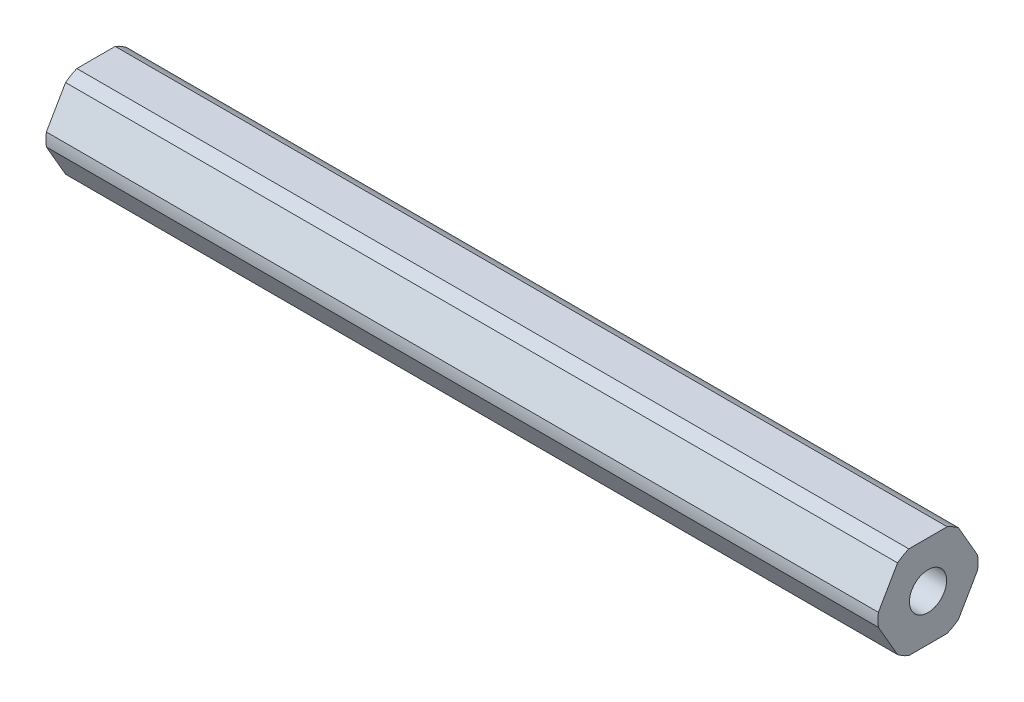
ISO-10303-21;
HEADER;
FILE_DESCRIPTION(('STEP AP214'),'2;1');
FILE_NAME('part.step','',(''),(''),'','','');
FILE_SCHEMA(('AUTOMOTIVE_DESIGN { 1 0 10303 214 1 1 1 1 }'));
ENDSEC;
DATA;
#1=APPLICATION_CONTEXT('core data for automotive mechanical design processes');
#2=APPLICATION_PROTOCOL_DEFINITION('international standard','automotive_design',2000,#1);
#3=PRODUCT_CONTEXT('',#1,'mechanical');
#4=PRODUCT('Part','Part','',(#3));
#5=PRODUCT_RELATED_PRODUCT_CATEGORY('part','',(#4));
#6=PRODUCT_DEFINITION_FORMATION('','',#4);
#7=PRODUCT_DEFINITION_CONTEXT('part definition',#1,'design');
#8=PRODUCT_DEFINITION('design','',#6,#7);
#9=PRODUCT_DEFINITION_SHAPE('','',#8);
#10=(LENGTH_UNIT() NAMED_UNIT(*) SI_UNIT(.MILLI.,.METRE.));
#11=(NAMED_UNIT(*) PLANE_ANGLE_UNIT() SI_UNIT($,.RADIAN.));
#12=(NAMED_UNIT(*) SI_UNIT($,.STERADIAN.) SOLID_ANGLE_UNIT());
#13=UNCERTAINTY_MEASURE_WITH_UNIT(LENGTH_MEASURE(1.E-05),#10,'distance_accuracy_value','');
#14=(GEOMETRIC_REPRESENTATION_CONTEXT(3) GLOBAL_UNCERTAINTY_ASSIGNED_CONTEXT((#13)) GLOBAL_UNIT_ASSIGNED_CONTEXT((#10,
#11,#12)) REPRESENTATION_CONTEXT('',''));
#15=CARTESIAN_POINT('',(0.,0.,0.));
#16=DIRECTION('',(0.,0.,1.));
#17=DIRECTION('',(1.,0.,0.));
#18=AXIS2_PLACEMENT_3D('',#15,#16,#17);
#19=CARTESIAN_POINT('',(57.15,0.,0.));
#20=DIRECTION('',(-1.,0.,0.));
#21=DIRECTION('',(0.,0.,1.));
#22=AXIS2_PLACEMENT_3D('',#19,#20,#21);
#23=CYLINDRICAL_SURFACE('',#22,6.875);
#24=CARTESIAN_POINT('',(-57.15,0.,0.));
#25=DIRECTION('',(-1.,0.,0.));
#26=DIRECTION('',(0.,0.,1.));
#27=AXIS2_PLACEMENT_3D('',#24,#25,#26);
#28=CIRCLE('',#27,6.875);
#29=CARTESIAN_POINT('',(-57.15,0.893039494206683,6.816751826331));
#30=VERTEX_POINT('',#29);
#31=CARTESIAN_POINT('',(-57.15,-0.893039494206785,6.81675182633099));
#32=VERTEX_POINT('',#31);
#33=EDGE_CURVE('E103',#30,#32,#28,.F.);
#34=ORIENTED_EDGE('',*,*,#33,.T.);
#35=DIRECTION('',(1.,0.,0.));
#36=VECTOR('',#35,1.);
#37=CARTESIAN_POINT('',(57.15,-0.893039494206782,6.81675182633099));
#38=LINE('',#37,#36);
#39=CARTESIAN_POINT('',(57.15,-0.893039494206785,6.81675182633099));
#40=VERTEX_POINT('',#39);
#41=EDGE_CURVE('E125',#32,#40,#38,.T.);
#42=ORIENTED_EDGE('',*,*,#41,.T.);
#43=CARTESIAN_POINT('',(57.15,0.,0.));
#44=DIRECTION('',(-1.,0.,0.));
#45=DIRECTION('',(0.,0.,1.));
#46=AXIS2_PLACEMENT_3D('',#43,#44,#45);
#47=CIRCLE('',#46,6.875);
#48=CARTESIAN_POINT('',(57.15,0.893039494206684,6.816751826331));
#49=VERTEX_POINT('',#48);
#50=EDGE_CURVE('E20',#40,#49,#47,.T.);
#51=ORIENTED_EDGE('',*,*,#50,.T.);
#52=DIRECTION('',(1.,0.,0.));
#53=VECTOR('',#52,1.);
#54=CARTESIAN_POINT('',(57.15,0.893039494206683,6.816751826331));
#55=LINE('',#54,#53);
#56=EDGE_CURVE('E121',#49,#30,#55,.F.);
#57=ORIENTED_EDGE('',*,*,#56,.T.);
#58=EDGE_LOOP('',(#34,#42,#51,#57));
#59=FACE_BOUND('',#58,.T.);
#60=ADVANCED_FACE('F17',(#59),#23,.T.);
#61=CARTESIAN_POINT('',(57.15,3.17499999999999,-5.49926131403116));
#62=DIRECTION('',(0.,-0.500000000000001,0.866025403784438));
#63=DIRECTION('',(0.,-0.866025403784438,-0.500000000000001));
#64=AXIS2_PLACEMENT_3D('',#61,#62,#63);
#65=PLANE('',#64);
#66=DIRECTION('',(-1.,0.,0.));
#67=VECTOR('',#66,1.);
#68=CARTESIAN_POINT('',(57.15,5.45696050579326,-4.18177080173132));
#69=LINE('',#68,#67);
#70=CARTESIAN_POINT('',(57.15,5.45696050579326,-4.18177080173132));
#71=VERTEX_POINT('',#70);
#72=CARTESIAN_POINT('',(-57.15,5.45696050579326,-4.18177080173132));
#73=VERTEX_POINT('',#72);
#74=EDGE_CURVE('E118',#71,#73,#69,.T.);
#75=ORIENTED_EDGE('',*,*,#74,.F.);
#76=DIRECTION('',(0.,0.866025403784438,0.500000000000001));
#77=VECTOR('',#76,1.);
#78=CARTESIAN_POINT('',(57.15,0.893039494206731,-6.816751826331));
#79=LINE('',#78,#77);
#80=CARTESIAN_POINT('',(57.15,0.893039494206733,-6.816751826331));
#81=VERTEX_POINT('',#80);
#82=EDGE_CURVE('E179',#81,#71,#79,.T.);
#83=ORIENTED_EDGE('',*,*,#82,.F.);
#84=DIRECTION('',(-1.,0.,0.));
#85=VECTOR('',#84,1.);
#86=CARTESIAN_POINT('',(57.15,0.893039494206732,-6.816751826331));
#87=LINE('',#86,#85);
#88=CARTESIAN_POINT('',(-57.15,0.893039494206733,-6.816751826331));
#89=VERTEX_POINT('',#88);
#90=EDGE_CURVE('E141',#89,#81,#87,.F.);
#91=ORIENTED_EDGE('',*,*,#90,.F.);
#92=DIRECTION('',(0.,0.866025403784438,0.500000000000001));
#93=VECTOR('',#92,1.);
#94=CARTESIAN_POINT('',(-57.15,0.893039494206731,-6.816751826331));
#95=LINE('',#94,#93);
#96=EDGE_CURVE('E183',#89,#73,#95,.T.);
#97=ORIENTED_EDGE('',*,*,#96,.T.);
#98=EDGE_LOOP('',(#75,#83,#91,#97));
#99=FACE_BOUND('',#98,.T.);
#100=ADVANCED_FACE('F202',(#99),#65,.F.);
#101=CARTESIAN_POINT('',(57.15,0.,0.));
#102=DIRECTION('',(-1.,0.,0.));
#103=DIRECTION('',(0.,0.,1.));
#104=AXIS2_PLACEMENT_3D('',#101,#102,#103);
#105=CYLINDRICAL_SURFACE('',#104,6.875);
#106=CARTESIAN_POINT('',(57.15,0.,0.));
#107=DIRECTION('',(-1.,0.,0.));
#108=DIRECTION('',(0.,0.,1.));
#109=AXIS2_PLACEMENT_3D('',#106,#107,#108);
#110=CIRCLE('',#109,6.875);
#111=CARTESIAN_POINT('',(57.15,6.34999999999998,-2.63498102459965));
#112=VERTEX_POINT('',#111);
#113=EDGE_CURVE('E177',#71,#112,#110,.F.);
#114=ORIENTED_EDGE('',*,*,#113,.F.);
#115=ORIENTED_EDGE('',*,*,#74,.T.);
#116=CARTESIAN_POINT('',(-57.15,0.,0.));
#117=DIRECTION('',(-1.,0.,0.));
#118=DIRECTION('',(0.,0.,1.));
#119=AXIS2_PLACEMENT_3D('',#116,#117,#118);
#120=CIRCLE('',#119,6.875);
#121=CARTESIAN_POINT('',(-57.15,6.34999999999998,-2.63498102459965));
#122=VERTEX_POINT('',#121);
#123=EDGE_CURVE('E140',#73,#122,#120,.F.);
#124=ORIENTED_EDGE('',*,*,#123,.T.);
#125=DIRECTION('',(1.,0.,0.));
#126=VECTOR('',#125,1.);
#127=CARTESIAN_POINT('',(57.15,6.34999999999998,-2.63498102459965));
#128=LINE('',#127,#126);
#129=EDGE_CURVE('E159',#122,#112,#128,.T.);
#130=ORIENTED_EDGE('',*,*,#129,.T.);
#131=EDGE_LOOP('',(#114,#115,#124,#130));
#132=FACE_BOUND('',#131,.T.);
#133=ADVANCED_FACE('F195',(#132),#105,.T.);
#134=CARTESIAN_POINT('',(57.15,6.34999999999997,0.));
#135=DIRECTION('',(0.,-1.,0.));
#136=DIRECTION('',(0.,0.,-1.));
#137=AXIS2_PLACEMENT_3D('',#134,#135,#136);
#138=PLANE('',#137);
#139=DIRECTION('',(-1.,0.,0.));
#140=VECTOR('',#139,1.);
#141=CARTESIAN_POINT('',(57.15,6.34999999999996,2.63498102459969));
#142=LINE('',#141,#140);
#143=CARTESIAN_POINT('',(57.15,6.34999999999997,2.63498102459967));
#144=VERTEX_POINT('',#143);
#145=CARTESIAN_POINT('',(-57.15,6.34999999999997,2.63498102459967));
#146=VERTEX_POINT('',#145);
#147=EDGE_CURVE('E156',#144,#146,#142,.T.);
#148=ORIENTED_EDGE('',*,*,#147,.F.);
#149=DIRECTION('',(0.,0.,-1.));
#150=VECTOR('',#149,1.);
#151=CARTESIAN_POINT('',(57.15,6.34999999999998,0.));
#152=LINE('',#151,#150);
#153=EDGE_CURVE('E176',#112,#144,#152,.F.);
#154=ORIENTED_EDGE('',*,*,#153,.F.);
#155=ORIENTED_EDGE('',*,*,#129,.F.);
#156=DIRECTION('',(0.,0.,-1.));
#157=VECTOR('',#156,1.);
#158=CARTESIAN_POINT('',(-57.15,6.34999999999998,0.));
#159=LINE('',#158,#157);
#160=EDGE_CURVE('E134',#122,#146,#159,.F.);
#161=ORIENTED_EDGE('',*,*,#160,.T.);
#162=EDGE_LOOP('',(#148,#154,#155,#161));
#163=FACE_BOUND('',#162,.T.);
#164=ADVANCED_FACE('F234',(#163),#138,.F.);
#165=CARTESIAN_POINT('',(57.15,0.,0.));
#166=DIRECTION('',(-1.,0.,0.));
#167=DIRECTION('',(0.,0.,1.));
#168=AXIS2_PLACEMENT_3D('',#165,#166,#167);
#169=CYLINDRICAL_SURFACE('',#168,6.875);
#170=CARTESIAN_POINT('',(57.15,0.,0.));
#171=DIRECTION('',(-1.,0.,0.));
#172=DIRECTION('',(0.,0.,1.));
#173=AXIS2_PLACEMENT_3D('',#170,#171,#172);
#174=CIRCLE('',#173,6.875);
#175=CARTESIAN_POINT('',(57.15,5.45696050579323,4.18177080173136));
#176=VERTEX_POINT('',#175);
#177=EDGE_CURVE('E173',#144,#176,#174,.F.);
#178=ORIENTED_EDGE('',*,*,#177,.F.);
#179=ORIENTED_EDGE('',*,*,#147,.T.);
#180=CARTESIAN_POINT('',(-57.15,0.,0.));
#181=DIRECTION('',(-1.,0.,0.));
#182=DIRECTION('',(0.,0.,1.));
#183=AXIS2_PLACEMENT_3D('',#180,#181,#182);
#184=CIRCLE('',#183,6.875);
#185=CARTESIAN_POINT('',(-57.15,5.45696050579323,4.18177080173136));
#186=VERTEX_POINT('',#185);
#187=EDGE_CURVE('E130',#146,#186,#184,.F.);
#188=ORIENTED_EDGE('',*,*,#187,.T.);
#189=DIRECTION('',(1.,0.,0.));
#190=VECTOR('',#189,1.);
#191=CARTESIAN_POINT('',(57.15,5.45696050579323,4.18177080173136));
#192=LINE('',#191,#190);
#193=EDGE_CURVE('E126',#186,#176,#192,.T.);
#194=ORIENTED_EDGE('',*,*,#193,.T.);
#195=EDGE_LOOP('',(#178,#179,#188,#194));
#196=FACE_BOUND('',#195,.T.);
#197=ADVANCED_FACE('F236',(#196),#169,.T.);
#198=CARTESIAN_POINT('',(57.15,3.17499999999995,5.49926131403118));
#199=DIRECTION('',(0.,-0.499999999999995,-0.866025403784441));
#200=DIRECTION('',(0.,0.866025403784441,-0.499999999999995));
#201=AXIS2_PLACEMENT_3D('',#198,#199,#200);
#202=PLANE('',#201);
#203=ORIENTED_EDGE('',*,*,#56,.F.);
#204=DIRECTION('',(0.,-0.866025403784441,0.499999999999995));
#205=VECTOR('',#204,1.);
#206=CARTESIAN_POINT('',(57.15,5.45696050579323,4.18177080173136));
#207=LINE('',#206,#205);
#208=EDGE_CURVE('E175',#176,#49,#207,.T.);
#209=ORIENTED_EDGE('',*,*,#208,.F.);
#210=ORIENTED_EDGE('',*,*,#193,.F.);
#211=DIRECTION('',(0.,-0.866025403784441,0.499999999999995));
#212=VECTOR('',#211,1.);
#213=CARTESIAN_POINT('',(-57.15,5.45696050579323,4.18177080173136));
#214=LINE('',#213,#212);
#215=EDGE_CURVE('E110',#186,#30,#214,.T.);
#216=ORIENTED_EDGE('',*,*,#215,.T.);
#217=EDGE_LOOP('',(#203,#209,#210,#216));
#218=FACE_BOUND('',#217,.T.);
#219=ADVANCED_FACE('F128',(#218),#202,.F.);
#220=CARTESIAN_POINT('',(57.15,-3.17500000000003,5.49926131403114));
#221=DIRECTION('',(0.,0.500000000000007,-0.866025403784435));
#222=DIRECTION('',(0.,0.866025403784435,0.500000000000007));
#223=AXIS2_PLACEMENT_3D('',#220,#221,#222);
#224=PLANE('',#223);
#225=DIRECTION('',(-1.,0.,0.));
#226=VECTOR('',#225,1.);
#227=CARTESIAN_POINT('',(57.15,-5.45696050579329,4.18177080173128));
#228=LINE('',#227,#226);
#229=CARTESIAN_POINT('',(57.15,-5.45696050579328,4.18177080173129));
#230=VERTEX_POINT('',#229);
#231=CARTESIAN_POINT('',(-57.15,-5.45696050579328,4.18177080173129));
#232=VERTEX_POINT('',#231);
#233=EDGE_CURVE('E153',#230,#232,#228,.T.);
#234=ORIENTED_EDGE('',*,*,#233,.F.);
#235=DIRECTION('',(0.,-0.866025403784435,-0.500000000000007));
#236=VECTOR('',#235,1.);
#237=CARTESIAN_POINT('',(57.15,-0.893039494206784,6.81675182633099));
#238=LINE('',#237,#236);
#239=EDGE_CURVE('E172',#40,#230,#238,.T.);
#240=ORIENTED_EDGE('',*,*,#239,.F.);
#241=ORIENTED_EDGE('',*,*,#41,.F.);
#242=DIRECTION('',(0.,-0.866025403784435,-0.500000000000007));
#243=VECTOR('',#242,1.);
#244=CARTESIAN_POINT('',(-57.15,-0.893039494206784,6.81675182633099));
#245=LINE('',#244,#243);
#246=EDGE_CURVE('E114',#32,#232,#245,.T.);
#247=ORIENTED_EDGE('',*,*,#246,.T.);
#248=EDGE_LOOP('',(#234,#240,#241,#247));
#249=FACE_BOUND('',#248,.T.);
#250=ADVANCED_FACE('F224',(#249),#224,.F.);
#251=CARTESIAN_POINT('',(57.15,0.,0.));
#252=DIRECTION('',(-1.,0.,0.));
#253=DIRECTION('',(0.,0.,1.));
#254=AXIS2_PLACEMENT_3D('',#251,#252,#253);
#255=CYLINDRICAL_SURFACE('',#254,6.875);
#256=CARTESIAN_POINT('',(57.15,0.,0.));
#257=DIRECTION('',(-1.,0.,0.));
#258=DIRECTION('',(0.,0.,1.));
#259=AXIS2_PLACEMENT_3D('',#256,#257,#258);
#260=CIRCLE('',#259,6.875);
#261=CARTESIAN_POINT('',(57.15,-6.35,2.6349810245996));
#262=VERTEX_POINT('',#261);
#263=EDGE_CURVE('E170',#230,#262,#260,.F.);
#264=ORIENTED_EDGE('',*,*,#263,.F.);
#265=ORIENTED_EDGE('',*,*,#233,.T.);
#266=CARTESIAN_POINT('',(-57.15,0.,0.));
#267=DIRECTION('',(-1.,0.,0.));
#268=DIRECTION('',(0.,0.,1.));
#269=AXIS2_PLACEMENT_3D('',#266,#267,#268);
#270=CIRCLE('',#269,6.875);
#271=CARTESIAN_POINT('',(-57.15,-6.35,2.6349810245996));
#272=VERTEX_POINT('',#271);
#273=EDGE_CURVE('E132',#232,#272,#270,.F.);
#274=ORIENTED_EDGE('',*,*,#273,.T.);
#275=DIRECTION('',(1.,0.,0.));
#276=VECTOR('',#275,1.);
#277=CARTESIAN_POINT('',(57.15,-6.35,2.6349810245996));
#278=LINE('',#277,#276);
#279=EDGE_CURVE('E150',#272,#262,#278,.T.);
#280=ORIENTED_EDGE('',*,*,#279,.T.);
#281=EDGE_LOOP('',(#264,#265,#274,#280));
#282=FACE_BOUND('',#281,.T.);
#283=ADVANCED_FACE('F220',(#282),#255,.T.);
#284=CARTESIAN_POINT('',(57.15,-6.34999999999997,0.));
#285=DIRECTION('',(0.,1.,0.));
#286=DIRECTION('',(0.,0.,1.));
#287=AXIS2_PLACEMENT_3D('',#284,#285,#286);
#288=PLANE('',#287);
#289=DIRECTION('',(-1.,0.,0.));
#290=VECTOR('',#289,1.);
#291=CARTESIAN_POINT('',(57.15,-6.34999999999995,-2.63498102459974));
#292=LINE('',#291,#290);
#293=CARTESIAN_POINT('',(57.15,-6.34999999999997,-2.63498102459967));
#294=VERTEX_POINT('',#293);
#295=CARTESIAN_POINT('',(-57.15,-6.34999999999997,-2.63498102459967));
#296=VERTEX_POINT('',#295);
#297=EDGE_CURVE('E148',#294,#296,#292,.T.);
#298=ORIENTED_EDGE('',*,*,#297,.F.);
#299=DIRECTION('',(0.,0.,-1.));
#300=VECTOR('',#299,1.);
#301=CARTESIAN_POINT('',(57.15,-6.35,0.));
#302=LINE('',#301,#300);
#303=EDGE_CURVE('E169',#262,#294,#302,.T.);
#304=ORIENTED_EDGE('',*,*,#303,.F.);
#305=ORIENTED_EDGE('',*,*,#279,.F.);
#306=DIRECTION('',(0.,0.,-1.));
#307=VECTOR('',#306,1.);
#308=CARTESIAN_POINT('',(-57.15,-6.35,0.));
#309=LINE('',#308,#307);
#310=EDGE_CURVE('E188',#272,#296,#309,.T.);
#311=ORIENTED_EDGE('',*,*,#310,.T.);
#312=EDGE_LOOP('',(#298,#304,#305,#311));
#313=FACE_BOUND('',#312,.T.);
#314=ADVANCED_FACE('F213',(#313),#288,.F.);
#315=CARTESIAN_POINT('',(57.15,0.,0.));
#316=DIRECTION('',(-1.,0.,0.));
#317=DIRECTION('',(0.,0.,1.));
#318=AXIS2_PLACEMENT_3D('',#315,#316,#317);
#319=CYLINDRICAL_SURFACE('',#318,6.875);
#320=CARTESIAN_POINT('',(57.15,0.,0.));
#321=DIRECTION('',(-1.,0.,0.));
#322=DIRECTION('',(0.,0.,1.));
#323=AXIS2_PLACEMENT_3D('',#320,#321,#322);
#324=CIRCLE('',#323,6.875);
#325=CARTESIAN_POINT('',(57.15,-5.45696050579318,-4.18177080173141));
#326=VERTEX_POINT('',#325);
#327=EDGE_CURVE('E167',#294,#326,#324,.F.);
#328=ORIENTED_EDGE('',*,*,#327,.F.);
#329=ORIENTED_EDGE('',*,*,#297,.T.);
#330=CARTESIAN_POINT('',(-57.15,0.,0.));
#331=DIRECTION('',(-1.,0.,0.));
#332=DIRECTION('',(0.,0.,1.));
#333=AXIS2_PLACEMENT_3D('',#330,#331,#332);
#334=CIRCLE('',#333,6.875);
#335=CARTESIAN_POINT('',(-57.15,-5.45696050579318,-4.18177080173141));
#336=VERTEX_POINT('',#335);
#337=EDGE_CURVE('E185',#296,#336,#334,.F.);
#338=ORIENTED_EDGE('',*,*,#337,.T.);
#339=DIRECTION('',(1.,0.,0.));
#340=VECTOR('',#339,1.);
#341=CARTESIAN_POINT('',(57.15,-5.45696050579318,-4.18177080173141));
#342=LINE('',#341,#340);
#343=EDGE_CURVE('E144',#336,#326,#342,.T.);
#344=ORIENTED_EDGE('',*,*,#343,.T.);
#345=EDGE_LOOP('',(#328,#329,#338,#344));
#346=FACE_BOUND('',#345,.T.);
#347=ADVANCED_FACE('F266',(#346),#319,.T.);
#348=CARTESIAN_POINT('',(57.15,-3.17499999999997,-5.4992613140312));
#349=DIRECTION('',(0.,0.499999999999995,0.866025403784442));
#350=DIRECTION('',(0.,-0.866025403784442,0.499999999999995));
#351=AXIS2_PLACEMENT_3D('',#348,#349,#350);
#352=PLANE('',#351);
#353=DIRECTION('',(-1.,0.,0.));
#354=VECTOR('',#353,1.);
#355=CARTESIAN_POINT('',(57.15,-0.893039494206752,-6.81675182633099));
#356=LINE('',#355,#354);
#357=CARTESIAN_POINT('',(57.15,-0.893039494206754,-6.81675182633099));
#358=VERTEX_POINT('',#357);
#359=CARTESIAN_POINT('',(-57.15,-0.893039494206754,-6.81675182633099));
#360=VERTEX_POINT('',#359);
#361=EDGE_CURVE('E143',#358,#360,#356,.T.);
#362=ORIENTED_EDGE('',*,*,#361,.F.);
#363=DIRECTION('',(0.,0.866025403784442,-0.499999999999995));
#364=VECTOR('',#363,1.);
#365=CARTESIAN_POINT('',(57.15,-5.45696050579319,-4.18177080173141));
#366=LINE('',#365,#364);
#367=EDGE_CURVE('E35',#326,#358,#366,.T.);
#368=ORIENTED_EDGE('',*,*,#367,.F.);
#369=ORIENTED_EDGE('',*,*,#343,.F.);
#370=DIRECTION('',(0.,0.866025403784442,-0.499999999999995));
#371=VECTOR('',#370,1.);
#372=CARTESIAN_POINT('',(-57.15,-5.45696050579319,-4.18177080173141));
#373=LINE('',#372,#371);
#374=EDGE_CURVE('E184',#336,#360,#373,.T.);
#375=ORIENTED_EDGE('',*,*,#374,.T.);
#376=EDGE_LOOP('',(#362,#368,#369,#375));
#377=FACE_BOUND('',#376,.T.);
#378=ADVANCED_FACE('F262',(#377),#352,.F.);
#379=CARTESIAN_POINT('',(57.15,0.,0.));
#380=DIRECTION('',(-1.,0.,0.));
#381=DIRECTION('',(0.,0.,1.));
#382=AXIS2_PLACEMENT_3D('',#379,#380,#381);
#383=CYLINDRICAL_SURFACE('',#382,6.875);
#384=CARTESIAN_POINT('',(57.15,0.,0.));
#385=DIRECTION('',(-1.,0.,0.));
#386=DIRECTION('',(0.,0.,1.));
#387=AXIS2_PLACEMENT_3D('',#384,#385,#386);
#388=CIRCLE('',#387,6.875);
#389=EDGE_CURVE('E165',#358,#81,#388,.F.);
#390=ORIENTED_EDGE('',*,*,#389,.F.);
#391=ORIENTED_EDGE('',*,*,#361,.T.);
#392=CARTESIAN_POINT('',(-57.15,0.,0.));
#393=DIRECTION('',(-1.,0.,0.));
#394=DIRECTION('',(0.,0.,1.));
#395=AXIS2_PLACEMENT_3D('',#392,#393,#394);
#396=CIRCLE('',#395,6.875);
#397=EDGE_CURVE('E180',#360,#89,#396,.F.);
#398=ORIENTED_EDGE('',*,*,#397,.T.);
#399=ORIENTED_EDGE('',*,*,#90,.T.);
#400=EDGE_LOOP('',(#390,#391,#398,#399));
#401=FACE_BOUND('',#400,.T.);
#402=ADVANCED_FACE('F259',(#401),#383,.T.);
#403=CARTESIAN_POINT('',(-57.15,0.,0.));
#404=DIRECTION('',(1.,0.,0.));
#405=DIRECTION('',(0.,0.,-1.));
#406=AXIS2_PLACEMENT_3D('',#403,#404,#405);
#407=PLANE('',#406);
#408=ORIENTED_EDGE('',*,*,#397,.F.);
#409=ORIENTED_EDGE('',*,*,#374,.F.);
#410=ORIENTED_EDGE('',*,*,#337,.F.);
#411=ORIENTED_EDGE('',*,*,#310,.F.);
#412=ORIENTED_EDGE('',*,*,#273,.F.);
#413=ORIENTED_EDGE('',*,*,#246,.F.);
#414=ORIENTED_EDGE('',*,*,#33,.F.);
#415=ORIENTED_EDGE('',*,*,#215,.F.);
#416=ORIENTED_EDGE('',*,*,#187,.F.);
#417=ORIENTED_EDGE('',*,*,#160,.F.);
#418=ORIENTED_EDGE('',*,*,#123,.F.);
#419=ORIENTED_EDGE('',*,*,#96,.F.);
#420=EDGE_LOOP('',(#408,#409,#410,#411,#412,#413,#414,#415,#416,#417,#418,#419));
#421=FACE_BOUND('',#420,.T.);
#422=CARTESIAN_POINT('',(-57.15,0.,0.));
#423=DIRECTION('',(-1.,0.,0.));
#424=DIRECTION('',(0.,0.,1.));
#425=AXIS2_PLACEMENT_3D('',#422,#423,#424);
#426=CIRCLE('',#425,2.5527);
#427=CARTESIAN_POINT('',(-57.15,0.,2.5527));
#428=VERTEX_POINT('',#427);
#429=EDGE_CURVE('E26',#428,#428,#426,.F.);
#430=ORIENTED_EDGE('',*,*,#429,.T.);
#431=EDGE_LOOP('',(#430));
#432=FACE_BOUND('',#431,.T.);
#433=ADVANCED_FACE('F106',(#421,#432),#407,.F.);
#434=CARTESIAN_POINT('',(57.15,0.,0.));
#435=DIRECTION('',(1.,0.,0.));
#436=DIRECTION('',(0.,0.,-1.));
#437=AXIS2_PLACEMENT_3D('',#434,#435,#436);
#438=PLANE('',#437);
#439=ORIENTED_EDGE('',*,*,#367,.T.);
#440=ORIENTED_EDGE('',*,*,#389,.T.);
#441=ORIENTED_EDGE('',*,*,#82,.T.);
#442=ORIENTED_EDGE('',*,*,#113,.T.);
#443=ORIENTED_EDGE('',*,*,#153,.T.);
#444=ORIENTED_EDGE('',*,*,#177,.T.);
#445=ORIENTED_EDGE('',*,*,#208,.T.);
#446=ORIENTED_EDGE('',*,*,#50,.F.);
#447=ORIENTED_EDGE('',*,*,#239,.T.);
#448=ORIENTED_EDGE('',*,*,#263,.T.);
#449=ORIENTED_EDGE('',*,*,#303,.T.);
#450=ORIENTED_EDGE('',*,*,#327,.T.);
#451=EDGE_LOOP('',(#439,#440,#441,#442,#443,#444,#445,#446,#447,#448,#449,#450));
#452=FACE_BOUND('',#451,.T.);
#453=CARTESIAN_POINT('',(57.15,0.,0.));
#454=DIRECTION('',(-1.,0.,0.));
#455=DIRECTION('',(0.,0.,1.));
#456=AXIS2_PLACEMENT_3D('',#453,#454,#455);
#457=CIRCLE('',#456,2.5527);
#458=CARTESIAN_POINT('',(57.15,0.,2.5527));
#459=VERTEX_POINT('',#458);
#460=EDGE_CURVE('E11',#459,#459,#457,.T.);
#461=ORIENTED_EDGE('',*,*,#460,.T.);
#462=EDGE_LOOP('',(#461));
#463=FACE_BOUND('',#462,.T.);
#464=ADVANCED_FACE('F230',(#452,#463),#438,.T.);
#465=CARTESIAN_POINT('',(57.15,0.,0.));
#466=DIRECTION('',(-1.,0.,0.));
#467=DIRECTION('',(0.,0.,1.));
#468=AXIS2_PLACEMENT_3D('',#465,#466,#467);
#469=CYLINDRICAL_SURFACE('',#468,2.5527);
#470=ORIENTED_EDGE('',*,*,#429,.F.);
#471=EDGE_LOOP('',(#470));
#472=FACE_BOUND('',#471,.T.);
#473=ORIENTED_EDGE('',*,*,#460,.F.);
#474=EDGE_LOOP('',(#473));
#475=FACE_BOUND('',#474,.T.);
#476=ADVANCED_FACE('F246',(#472,#475),#469,.F.);
#477=CLOSED_SHELL('',(#60,#100,#133,#164,#197,#219,#250,#283,#314,#347,#378,#402,#433,#464,#476));
#478=MANIFOLD_SOLID_BREP('B1',#477);
#479=ADVANCED_BREP_SHAPE_REPRESENTATION('',(#18,#478),#14);
#480=SHAPE_DEFINITION_REPRESENTATION(#9,#479);
ENDSEC;
END-ISO-10303-21;
